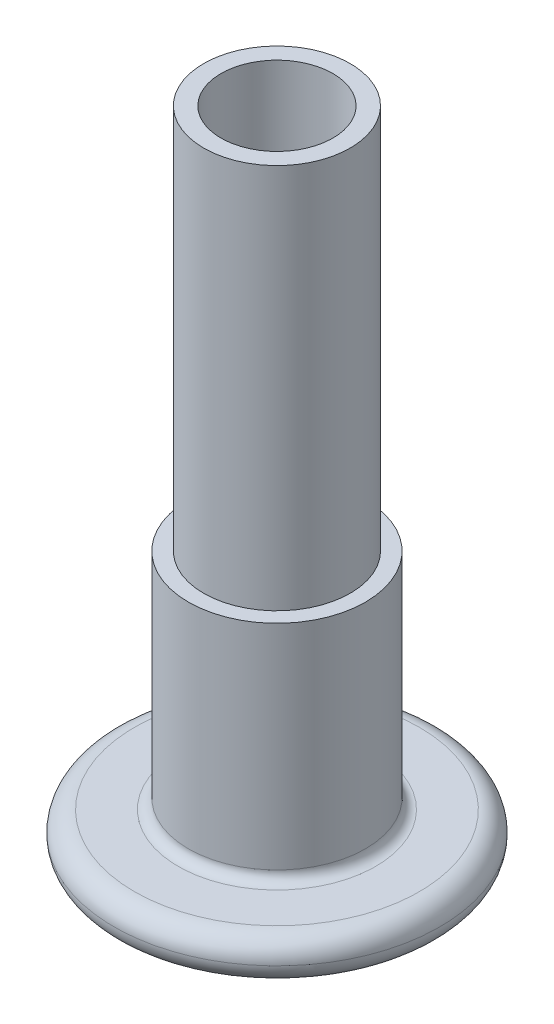
ISO-10303-21;
HEADER;
FILE_DESCRIPTION(('STEP AP214'),'2;1');
FILE_NAME('part.step','',(''),(''),'','','');
FILE_SCHEMA(('AUTOMOTIVE_DESIGN { 1 0 10303 214 1 1 1 1 }'));
ENDSEC;
DATA;
#1=APPLICATION_CONTEXT('core data for automotive mechanical design processes');
#2=APPLICATION_PROTOCOL_DEFINITION('international standard','automotive_design',2000,#1);
#3=PRODUCT_CONTEXT('',#1,'mechanical');
#4=PRODUCT('Part','Part','',(#3));
#5=PRODUCT_RELATED_PRODUCT_CATEGORY('part','',(#4));
#6=PRODUCT_DEFINITION_FORMATION('','',#4);
#7=PRODUCT_DEFINITION_CONTEXT('part definition',#1,'design');
#8=PRODUCT_DEFINITION('design','',#6,#7);
#9=PRODUCT_DEFINITION_SHAPE('','',#8);
#10=(LENGTH_UNIT() NAMED_UNIT(*) SI_UNIT(.MILLI.,.METRE.));
#11=(NAMED_UNIT(*) PLANE_ANGLE_UNIT() SI_UNIT($,.RADIAN.));
#12=(NAMED_UNIT(*) SI_UNIT($,.STERADIAN.) SOLID_ANGLE_UNIT());
#13=UNCERTAINTY_MEASURE_WITH_UNIT(LENGTH_MEASURE(1.E-05),#10,'distance_accuracy_value','');
#14=(GEOMETRIC_REPRESENTATION_CONTEXT(3) GLOBAL_UNCERTAINTY_ASSIGNED_CONTEXT((#13)) GLOBAL_UNIT_ASSIGNED_CONTEXT((#10,
#11,#12)) REPRESENTATION_CONTEXT('',''));
#15=CARTESIAN_POINT('',(0.,0.,0.));
#16=DIRECTION('',(0.,0.,1.));
#17=DIRECTION('',(1.,0.,0.));
#18=AXIS2_PLACEMENT_3D('',#15,#16,#17);
#19=CARTESIAN_POINT('',(0.,68.8,0.));
#20=DIRECTION('',(0.,-1.,0.));
#21=DIRECTION('',(0.,0.,-1.));
#22=AXIS2_PLACEMENT_3D('',#19,#20,#21);
#23=CYLINDRICAL_SURFACE('',#22,8.7);
#24=CARTESIAN_POINT('',(0.,1.,0.));
#25=DIRECTION('',(0.,-1.,0.));
#26=DIRECTION('',(0.,0.,-1.));
#27=AXIS2_PLACEMENT_3D('',#24,#25,#26);
#28=CIRCLE('',#27,8.7);
#29=CARTESIAN_POINT('',(0.,1.00000000000001,-8.7));
#30=VERTEX_POINT('',#29);
#31=EDGE_CURVE('E10',#30,#30,#28,.F.);
#32=CARTESIAN_POINT('',(0.,22.,0.));
#33=DIRECTION('',(0.,1.,0.));
#34=DIRECTION('',(0.,0.,1.));
#35=AXIS2_PLACEMENT_3D('',#32,#33,#34);
#36=CIRCLE('',#35,8.7);
#37=CARTESIAN_POINT('',(0.,22.,-8.7));
#38=VERTEX_POINT('',#37);
#39=EDGE_CURVE('E53',#38,#38,#36,.T.);
#40=CARTESIAN_POINT('',(0.,1.00000000000001,-8.7));
#41=CARTESIAN_POINT('',(0.,1.21875000000001,-8.7));
#42=CARTESIAN_POINT('',(0.,1.43750000000001,-8.7));
#43=CARTESIAN_POINT('',(0.,1.87500000000001,-8.7));
#44=CARTESIAN_POINT('',(0.,2.09375000000001,-8.7));
#45=CARTESIAN_POINT('',(0.,2.53125000000001,-8.7));
#46=CARTESIAN_POINT('',(0.,2.75000000000002,-8.7));
#47=CARTESIAN_POINT('',(0.,3.18750000000002,-8.7));
#48=CARTESIAN_POINT('',(0.,3.40625000000002,-8.7));
#49=CARTESIAN_POINT('',(0.,3.84375000000002,-8.7));
#50=CARTESIAN_POINT('',(0.,4.06250000000002,-8.7));
#51=CARTESIAN_POINT('',(0.,4.50000000000001,-8.7));
#52=CARTESIAN_POINT('',(0.,4.71875000000001,-8.7));
#53=CARTESIAN_POINT('',(0.,5.15625000000001,-8.7));
#54=CARTESIAN_POINT('',(0.,5.37500000000001,-8.7));
#55=CARTESIAN_POINT('',(0.,5.81250000000001,-8.7));
#56=CARTESIAN_POINT('',(0.,6.03125000000002,-8.7));
#57=CARTESIAN_POINT('',(0.,6.46875000000001,-8.7));
#58=CARTESIAN_POINT('',(0.,6.68750000000001,-8.7));
#59=CARTESIAN_POINT('',(0.,7.125,-8.7));
#60=CARTESIAN_POINT('',(0.,7.34375000000001,-8.7));
#61=CARTESIAN_POINT('',(0.,7.78125000000001,-8.7));
#62=CARTESIAN_POINT('',(0.,8.00000000000001,-8.7));
#63=CARTESIAN_POINT('',(0.,8.4375,-8.7));
#64=CARTESIAN_POINT('',(0.,8.65625,-8.7));
#65=CARTESIAN_POINT('',(0.,9.09375,-8.7));
#66=CARTESIAN_POINT('',(0.,9.3125,-8.7));
#67=CARTESIAN_POINT('',(0.,9.75,-8.7));
#68=CARTESIAN_POINT('',(0.,9.96875,-8.7));
#69=CARTESIAN_POINT('',(0.,10.40625,-8.7));
#70=CARTESIAN_POINT('',(0.,10.625,-8.7));
#71=CARTESIAN_POINT('',(0.,11.0625,-8.7));
#72=CARTESIAN_POINT('',(0.,11.28125,-8.7));
#73=CARTESIAN_POINT('',(0.,11.71875,-8.7));
#74=CARTESIAN_POINT('',(0.,11.9375,-8.7));
#75=CARTESIAN_POINT('',(0.,12.375,-8.7));
#76=CARTESIAN_POINT('',(0.,12.59375,-8.7));
#77=CARTESIAN_POINT('',(0.,13.03125,-8.7));
#78=CARTESIAN_POINT('',(0.,13.25,-8.7));
#79=CARTESIAN_POINT('',(0.,13.6875,-8.7));
#80=CARTESIAN_POINT('',(0.,13.90625,-8.7));
#81=CARTESIAN_POINT('',(0.,14.34375,-8.7));
#82=CARTESIAN_POINT('',(0.,14.5625,-8.7));
#83=CARTESIAN_POINT('',(0.,15.,-8.7));
#84=CARTESIAN_POINT('',(0.,15.21875,-8.7));
#85=CARTESIAN_POINT('',(0.,15.65625,-8.7));
#86=CARTESIAN_POINT('',(0.,15.875,-8.7));
#87=CARTESIAN_POINT('',(0.,16.3125,-8.7));
#88=CARTESIAN_POINT('',(0.,16.53125,-8.7));
#89=CARTESIAN_POINT('',(0.,16.96875,-8.7));
#90=CARTESIAN_POINT('',(0.,17.1875,-8.7));
#91=CARTESIAN_POINT('',(0.,17.625,-8.7));
#92=CARTESIAN_POINT('',(0.,17.84375,-8.7));
#93=CARTESIAN_POINT('',(0.,18.28125,-8.7));
#94=CARTESIAN_POINT('',(0.,18.5,-8.7));
#95=CARTESIAN_POINT('',(0.,18.9375,-8.7));
#96=CARTESIAN_POINT('',(0.,19.15625,-8.7));
#97=CARTESIAN_POINT('',(0.,19.59375,-8.7));
#98=CARTESIAN_POINT('',(0.,19.8125,-8.7));
#99=CARTESIAN_POINT('',(0.,20.25,-8.7));
#100=CARTESIAN_POINT('',(0.,20.46875,-8.7));
#101=CARTESIAN_POINT('',(0.,20.90625,-8.7));
#102=CARTESIAN_POINT('',(0.,21.125,-8.7));
#103=CARTESIAN_POINT('',(0.,21.5625,-8.7));
#104=CARTESIAN_POINT('',(0.,21.78125,-8.7));
#105=CARTESIAN_POINT('',(0.,22.,-8.7));
#106=B_SPLINE_CURVE_WITH_KNOTS('',3,(#40,#41,#42,#43,#44,#45,#46,#47,#48,#49,#50,#51,#52,#53,
#54,#55,#56,#57,#58,#59,#60,#61,#62,#63,#64,#65,#66,#67,#68,#69,#70,#71,#72,#73,#74,#75,#76,#77,
#78,#79,#80,#81,#82,#83,#84,#85,#86,#87,#88,#89,#90,#91,#92,#93,#94,#95,#96,#97,#98,#99,#100,
#101,#102,#103,#104,#105),.UNSPECIFIED.,.F.,.F.,(4,2,2,2,2,2,2,2,2,2,2,2,2,2,2,2,2,2,2,2,2,2,2,
2,2,2,2,2,2,2,2,2,4),(0.,0.656249999999997,1.31249999999999,1.96875000000001,2.625,3.28125,
3.9375,4.59374999999999,5.25,5.90624999999999,6.56249999999999,7.21874999999999,
7.87499999999999,8.53124999999999,9.18749999999999,9.84374999999999,10.5,11.15625,11.8125,
12.46875,13.125,13.78125,14.4375,15.09375,15.75,16.40625,17.0625,17.71875,18.375,19.03125,
19.6875,20.34375,21.),.UNSPECIFIED.);
#107=EDGE_CURVE('BSEAM32',#30,#38,#106,.T.);
#108=ORIENTED_EDGE('',*,*,#31,.T.);
#109=ORIENTED_EDGE('',*,*,#39,.F.);
#110=ORIENTED_EDGE('',*,*,#107,.T.);
#111=ORIENTED_EDGE('',*,*,#107,.F.);
#112=EDGE_LOOP('',(#108,#110,#109,#111));
#113=FACE_BOUND('',#112,.T.);
#114=ADVANCED_FACE('F32',(#113),#23,.T.);
#115=CARTESIAN_POINT('',(0.,68.8,0.));
#116=DIRECTION('',(0.,-1.,0.));
#117=DIRECTION('',(0.,0.,-1.));
#118=AXIS2_PLACEMENT_3D('',#115,#116,#117);
#119=CYLINDRICAL_SURFACE('',#118,5.5);
#120=CARTESIAN_POINT('',(0.,-4.,0.));
#121=DIRECTION('',(0.,-1.,0.));
#122=DIRECTION('',(0.,0.,-1.));
#123=AXIS2_PLACEMENT_3D('',#120,#121,#122);
#124=CIRCLE('',#123,5.5);
#125=CARTESIAN_POINT('',(0.,-3.99999999999999,-5.5));
#126=VERTEX_POINT('',#125);
#127=EDGE_CURVE('E52',#126,#126,#124,.T.);
#128=CARTESIAN_POINT('',(0.,59.9,0.));
#129=DIRECTION('',(0.,1.,0.));
#130=DIRECTION('',(0.,0.,1.));
#131=AXIS2_PLACEMENT_3D('',#128,#129,#130);
#132=CIRCLE('',#131,5.5);
#133=CARTESIAN_POINT('',(0.,59.9,-5.5));
#134=VERTEX_POINT('',#133);
#135=EDGE_CURVE('E67',#134,#134,#132,.T.);
#136=CARTESIAN_POINT('',(0.,-3.99999999999999,-5.5));
#137=CARTESIAN_POINT('',(0.,-3.33437499999999,-5.5));
#138=CARTESIAN_POINT('',(0.,-2.66874999999999,-5.5));
#139=CARTESIAN_POINT('',(0.,-1.33749999999999,-5.5));
#140=CARTESIAN_POINT('',(0.,-0.671874999999988,-5.5));
#141=CARTESIAN_POINT('',(0.,0.659375000000013,-5.5));
#142=CARTESIAN_POINT('',(0.,1.32500000000001,-5.5));
#143=CARTESIAN_POINT('',(0.,2.65625000000001,-5.5));
#144=CARTESIAN_POINT('',(0.,3.32187500000001,-5.5));
#145=CARTESIAN_POINT('',(0.,4.653125,-5.5));
#146=CARTESIAN_POINT('',(0.,5.31875,-5.5));
#147=CARTESIAN_POINT('',(0.,6.65,-5.5));
#148=CARTESIAN_POINT('',(0.,7.315625,-5.5));
#149=CARTESIAN_POINT('',(0.,8.646875,-5.5));
#150=CARTESIAN_POINT('',(0.,9.3125,-5.5));
#151=CARTESIAN_POINT('',(0.,10.64375,-5.5));
#152=CARTESIAN_POINT('',(0.,11.309375,-5.5));
#153=CARTESIAN_POINT('',(0.,12.640625,-5.5));
#154=CARTESIAN_POINT('',(0.,13.30625,-5.5));
#155=CARTESIAN_POINT('',(0.,14.6375,-5.5));
#156=CARTESIAN_POINT('',(0.,15.303125,-5.5));
#157=CARTESIAN_POINT('',(0.,16.634375,-5.5));
#158=CARTESIAN_POINT('',(0.,17.3,-5.5));
#159=CARTESIAN_POINT('',(0.,18.63125,-5.5));
#160=CARTESIAN_POINT('',(0.,19.296875,-5.5));
#161=CARTESIAN_POINT('',(0.,20.628125,-5.5));
#162=CARTESIAN_POINT('',(0.,21.29375,-5.5));
#163=CARTESIAN_POINT('',(0.,22.625,-5.5));
#164=CARTESIAN_POINT('',(0.,23.290625,-5.5));
#165=CARTESIAN_POINT('',(0.,24.621875,-5.5));
#166=CARTESIAN_POINT('',(0.,25.2875,-5.5));
#167=CARTESIAN_POINT('',(0.,26.61875,-5.5));
#168=CARTESIAN_POINT('',(0.,27.284375,-5.5));
#169=CARTESIAN_POINT('',(0.,28.615625,-5.5));
#170=CARTESIAN_POINT('',(0.,29.28125,-5.5));
#171=CARTESIAN_POINT('',(0.,30.6125,-5.5));
#172=CARTESIAN_POINT('',(0.,31.278125,-5.5));
#173=CARTESIAN_POINT('',(0.,32.609375,-5.5));
#174=CARTESIAN_POINT('',(0.,33.275,-5.5));
#175=CARTESIAN_POINT('',(0.,34.60625,-5.5));
#176=CARTESIAN_POINT('',(0.,35.271875,-5.5));
#177=CARTESIAN_POINT('',(0.,36.603125,-5.5));
#178=CARTESIAN_POINT('',(0.,37.26875,-5.5));
#179=CARTESIAN_POINT('',(0.,38.6,-5.5));
#180=CARTESIAN_POINT('',(0.,39.265625,-5.5));
#181=CARTESIAN_POINT('',(0.,40.596875,-5.5));
#182=CARTESIAN_POINT('',(0.,41.2625,-5.5));
#183=CARTESIAN_POINT('',(0.,42.59375,-5.5));
#184=CARTESIAN_POINT('',(0.,43.259375,-5.5));
#185=CARTESIAN_POINT('',(0.,44.590625,-5.5));
#186=CARTESIAN_POINT('',(0.,45.25625,-5.5));
#187=CARTESIAN_POINT('',(0.,46.5875,-5.5));
#188=CARTESIAN_POINT('',(0.,47.253125,-5.5));
#189=CARTESIAN_POINT('',(0.,48.584375,-5.5));
#190=CARTESIAN_POINT('',(0.,49.25,-5.5));
#191=CARTESIAN_POINT('',(0.,50.58125,-5.5));
#192=CARTESIAN_POINT('',(0.,51.246875,-5.5));
#193=CARTESIAN_POINT('',(0.,52.578125,-5.5));
#194=CARTESIAN_POINT('',(0.,53.24375,-5.5));
#195=CARTESIAN_POINT('',(0.,54.575,-5.5));
#196=CARTESIAN_POINT('',(0.,55.240625,-5.5));
#197=CARTESIAN_POINT('',(0.,56.571875,-5.5));
#198=CARTESIAN_POINT('',(0.,57.2375,-5.5));
#199=CARTESIAN_POINT('',(0.,58.56875,-5.5));
#200=CARTESIAN_POINT('',(0.,59.234375,-5.5));
#201=CARTESIAN_POINT('',(0.,59.9,-5.5));
#202=B_SPLINE_CURVE_WITH_KNOTS('',3,(#136,#137,#138,#139,#140,#141,#142,#143,#144,#145,#146,
#147,#148,#149,#150,#151,#152,#153,#154,#155,#156,#157,#158,#159,#160,#161,#162,#163,#164,#165,
#166,#167,#168,#169,#170,#171,#172,#173,#174,#175,#176,#177,#178,#179,#180,#181,#182,#183,#184,
#185,#186,#187,#188,#189,#190,#191,#192,#193,#194,#195,#196,#197,#198,#199,#200,#201),
.UNSPECIFIED.,.F.,.F.,(4,2,2,2,2,2,2,2,2,2,2,2,2,2,2,2,2,2,2,2,2,2,2,2,2,2,2,2,2,2,2,2,4),(0.,
1.996875,3.99375,5.990625,7.98749999999999,9.98437499999999,11.98125,13.978125,15.975,17.971875,
19.96875,21.965625,23.9625,25.959375,27.95625,29.953125,31.95,33.946875,35.94375,37.940625,
39.9375,41.934375,43.93125,45.928125,47.925,49.921875,51.91875,53.915625,55.9125,57.909375,
59.90625,61.903125,63.9),.UNSPECIFIED.);
#203=EDGE_CURVE('BSEAM71',#126,#134,#202,.T.);
#204=ORIENTED_EDGE('',*,*,#127,.T.);
#205=ORIENTED_EDGE('',*,*,#135,.T.);
#206=ORIENTED_EDGE('',*,*,#203,.T.);
#207=ORIENTED_EDGE('',*,*,#203,.F.);
#208=EDGE_LOOP('',(#204,#206,#205,#207));
#209=FACE_BOUND('',#208,.T.);
#210=ADVANCED_FACE('F71',(#209),#119,.F.);
#211=CARTESIAN_POINT('',(0.,0.,0.));
#212=DIRECTION('',(0.,-1.,0.));
#213=DIRECTION('',(0.,0.,-1.));
#214=AXIS2_PLACEMENT_3D('',#211,#212,#213);
#215=PLANE('',#214);
#216=CARTESIAN_POINT('',(0.,0.,0.));
#217=DIRECTION('',(0.,-1.,0.));
#218=DIRECTION('',(0.,0.,-1.));
#219=AXIS2_PLACEMENT_3D('',#216,#217,#218);
#220=CIRCLE('',#219,9.7);
#221=CARTESIAN_POINT('',(0.,0.,-9.7));
#222=VERTEX_POINT('',#221);
#223=EDGE_CURVE('E39',#222,#222,#220,.T.);
#224=ORIENTED_EDGE('',*,*,#223,.T.);
#225=EDGE_LOOP('',(#224));
#226=FACE_BOUND('',#225,.T.);
#227=CARTESIAN_POINT('',(0.,0.,0.));
#228=DIRECTION('',(0.,-1.,0.));
#229=DIRECTION('',(0.,0.,-1.));
#230=AXIS2_PLACEMENT_3D('',#227,#228,#229);
#231=CIRCLE('',#230,14.);
#232=CARTESIAN_POINT('',(0.,0.,-14.));
#233=VERTEX_POINT('',#232);
#234=EDGE_CURVE('E43',#233,#233,#231,.F.);
#235=ORIENTED_EDGE('',*,*,#234,.T.);
#236=EDGE_LOOP('',(#235));
#237=FACE_BOUND('',#236,.T.);
#238=ADVANCED_FACE('F89',(#226,#237),#215,.F.);
#239=CARTESIAN_POINT('',(0.,-4.,0.));
#240=DIRECTION('',(0.,-1.,0.));
#241=DIRECTION('',(0.,0.,-1.));
#242=AXIS2_PLACEMENT_3D('',#239,#240,#241);
#243=PLANE('',#242);
#244=CARTESIAN_POINT('',(0.,-4.,0.));
#245=DIRECTION('',(0.,-1.,0.));
#246=DIRECTION('',(0.,0.,-1.));
#247=AXIS2_PLACEMENT_3D('',#244,#245,#246);
#248=CIRCLE('',#247,14.);
#249=CARTESIAN_POINT('',(0.,-4.,-14.));
#250=VERTEX_POINT('',#249);
#251=EDGE_CURVE('E47',#250,#250,#248,.T.);
#252=ORIENTED_EDGE('',*,*,#251,.T.);
#253=EDGE_LOOP('',(#252));
#254=FACE_BOUND('',#253,.T.);
#255=ORIENTED_EDGE('',*,*,#127,.F.);
#256=EDGE_LOOP('',(#255));
#257=FACE_BOUND('',#256,.T.);
#258=ADVANCED_FACE('F100',(#254,#257),#243,.T.);
#259=CARTESIAN_POINT('',(0.,-2.,0.));
#260=DIRECTION('',(0.,-1.,0.));
#261=DIRECTION('',(0.,0.,-1.));
#262=AXIS2_PLACEMENT_3D('',#259,#260,#261);
#263=TOROIDAL_SURFACE('',#262,14.,2.);
#264=ORIENTED_EDGE('',*,*,#234,.F.);
#265=EDGE_LOOP('',(#264));
#266=FACE_BOUND('',#265,.T.);
#267=CARTESIAN_POINT('',(0.,-2.,0.));
#268=DIRECTION('',(0.,-1.,0.));
#269=DIRECTION('',(0.,0.,-1.));
#270=AXIS2_PLACEMENT_3D('',#267,#268,#269);
#271=CIRCLE('',#270,16.);
#272=CARTESIAN_POINT('',(0.,-2.,-16.));
#273=VERTEX_POINT('',#272);
#274=EDGE_CURVE('E50',#273,#273,#271,.T.);
#275=ORIENTED_EDGE('',*,*,#274,.F.);
#276=EDGE_LOOP('',(#275));
#277=FACE_BOUND('',#276,.T.);
#278=ADVANCED_FACE('F97',(#266,#277),#263,.T.);
#279=CARTESIAN_POINT('',(0.,-2.,0.));
#280=DIRECTION('',(0.,-1.,0.));
#281=DIRECTION('',(0.,0.,-1.));
#282=AXIS2_PLACEMENT_3D('',#279,#280,#281);
#283=TOROIDAL_SURFACE('',#282,14.,2.);
#284=ORIENTED_EDGE('',*,*,#274,.T.);
#285=EDGE_LOOP('',(#284));
#286=FACE_BOUND('',#285,.T.);
#287=ORIENTED_EDGE('',*,*,#251,.F.);
#288=EDGE_LOOP('',(#287));
#289=FACE_BOUND('',#288,.T.);
#290=ADVANCED_FACE('F95',(#286,#289),#283,.T.);
#291=CARTESIAN_POINT('',(0.,1.,0.));
#292=DIRECTION('',(0.,-1.,0.));
#293=DIRECTION('',(0.,0.,-1.));
#294=AXIS2_PLACEMENT_3D('',#291,#292,#293);
#295=TOROIDAL_SURFACE('',#294,9.7,1.);
#296=ORIENTED_EDGE('',*,*,#31,.F.);
#297=EDGE_LOOP('',(#296));
#298=FACE_BOUND('',#297,.T.);
#299=ORIENTED_EDGE('',*,*,#223,.F.);
#300=EDGE_LOOP('',(#299));
#301=FACE_BOUND('',#300,.T.);
#302=ADVANCED_FACE('F34',(#298,#301),#295,.F.);
#303=CARTESIAN_POINT('',(0.,22.,0.));
#304=DIRECTION('',(0.,1.,0.));
#305=DIRECTION('',(0.,0.,1.));
#306=AXIS2_PLACEMENT_3D('',#303,#304,#305);
#307=PLANE('',#306);
#308=CARTESIAN_POINT('',(0.,22.,0.));
#309=DIRECTION('',(0.,1.,0.));
#310=DIRECTION('',(0.,0.,1.));
#311=AXIS2_PLACEMENT_3D('',#308,#309,#310);
#312=CIRCLE('',#311,7.2);
#313=CARTESIAN_POINT('',(0.,22.,7.2));
#314=VERTEX_POINT('',#313);
#315=EDGE_CURVE('E61',#314,#314,#312,.T.);
#316=ORIENTED_EDGE('',*,*,#315,.F.);
#317=EDGE_LOOP('',(#316));
#318=FACE_BOUND('',#317,.T.);
#319=ORIENTED_EDGE('',*,*,#39,.T.);
#320=EDGE_LOOP('',(#319));
#321=FACE_BOUND('',#320,.T.);
#322=ADVANCED_FACE('F81',(#318,#321),#307,.T.);
#323=CARTESIAN_POINT('',(0.,22.,0.));
#324=DIRECTION('',(0.,1.,0.));
#325=DIRECTION('',(0.,0.,1.));
#326=AXIS2_PLACEMENT_3D('',#323,#324,#325);
#327=CYLINDRICAL_SURFACE('',#326,7.2);
#328=ORIENTED_EDGE('',*,*,#315,.T.);
#329=EDGE_LOOP('',(#328));
#330=FACE_BOUND('',#329,.T.);
#331=CARTESIAN_POINT('',(0.,59.9,0.));
#332=DIRECTION('',(0.,1.,0.));
#333=DIRECTION('',(0.,0.,1.));
#334=AXIS2_PLACEMENT_3D('',#331,#332,#333);
#335=CIRCLE('',#334,7.2);
#336=CARTESIAN_POINT('',(0.,59.9,7.2));
#337=VERTEX_POINT('',#336);
#338=EDGE_CURVE('E64',#337,#337,#335,.T.);
#339=ORIENTED_EDGE('',*,*,#338,.F.);
#340=EDGE_LOOP('',(#339));
#341=FACE_BOUND('',#340,.T.);
#342=ADVANCED_FACE('F75',(#330,#341),#327,.T.);
#343=CARTESIAN_POINT('',(0.,59.9,0.));
#344=DIRECTION('',(0.,1.,0.));
#345=DIRECTION('',(0.,0.,1.));
#346=AXIS2_PLACEMENT_3D('',#343,#344,#345);
#347=PLANE('',#346);
#348=ORIENTED_EDGE('',*,*,#338,.T.);
#349=EDGE_LOOP('',(#348));
#350=FACE_BOUND('',#349,.T.);
#351=ORIENTED_EDGE('',*,*,#135,.F.);
#352=EDGE_LOOP('',(#351));
#353=FACE_BOUND('',#352,.T.);
#354=ADVANCED_FACE('F73',(#350,#353),#347,.T.);
#355=CLOSED_SHELL('',(#114,#210,#238,#258,#278,#290,#302,#322,#342,#354));
#356=MANIFOLD_SOLID_BREP('B2',#355);
#357=ADVANCED_BREP_SHAPE_REPRESENTATION('',(#18,#356),#14);
#358=SHAPE_DEFINITION_REPRESENTATION(#9,#357);
ENDSEC;
END-ISO-10303-21;
